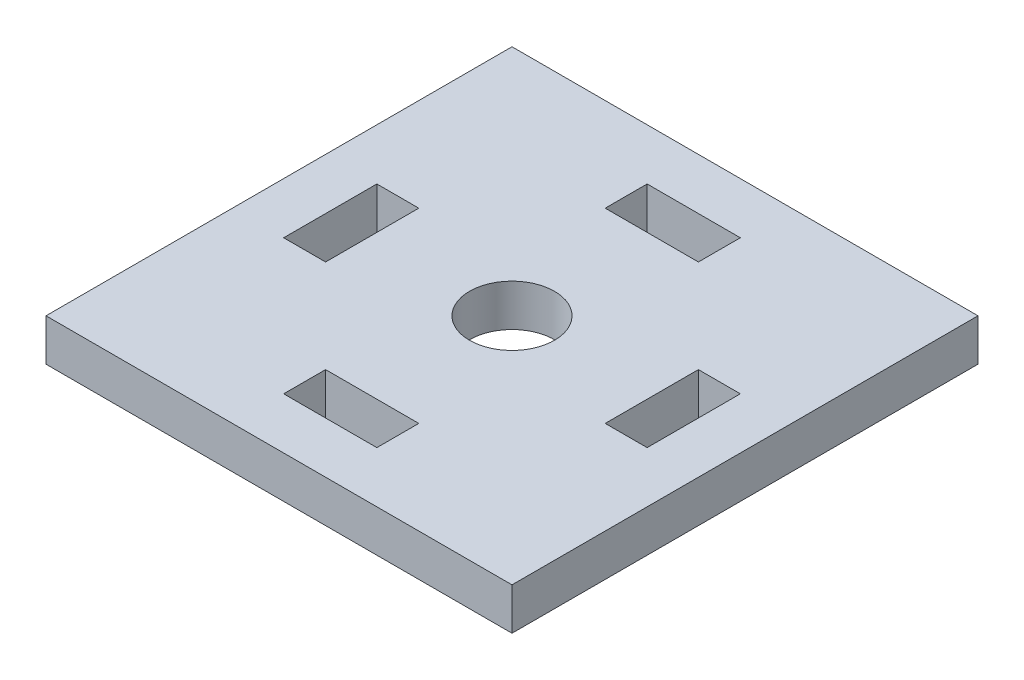
ISO-10303-21;
HEADER;
FILE_DESCRIPTION(('STEP AP214'),'2;1');
FILE_NAME('part.step','',(''),(''),'','','');
FILE_SCHEMA(('AUTOMOTIVE_DESIGN { 1 0 10303 214 1 1 1 1 }'));
ENDSEC;
DATA;
#1=APPLICATION_CONTEXT('core data for automotive mechanical design processes');
#2=APPLICATION_PROTOCOL_DEFINITION('international standard','automotive_design',2000,#1);
#3=PRODUCT_CONTEXT('',#1,'mechanical');
#4=PRODUCT('Part','Part','',(#3));
#5=PRODUCT_RELATED_PRODUCT_CATEGORY('part','',(#4));
#6=PRODUCT_DEFINITION_FORMATION('','',#4);
#7=PRODUCT_DEFINITION_CONTEXT('part definition',#1,'design');
#8=PRODUCT_DEFINITION('design','',#6,#7);
#9=PRODUCT_DEFINITION_SHAPE('','',#8);
#10=(LENGTH_UNIT() NAMED_UNIT(*) SI_UNIT(.MILLI.,.METRE.));
#11=(NAMED_UNIT(*) PLANE_ANGLE_UNIT() SI_UNIT($,.RADIAN.));
#12=(NAMED_UNIT(*) SI_UNIT($,.STERADIAN.) SOLID_ANGLE_UNIT());
#13=UNCERTAINTY_MEASURE_WITH_UNIT(LENGTH_MEASURE(1.E-05),#10,'distance_accuracy_value','');
#14=(GEOMETRIC_REPRESENTATION_CONTEXT(3) GLOBAL_UNCERTAINTY_ASSIGNED_CONTEXT((#13)) GLOBAL_UNIT_ASSIGNED_CONTEXT((#10,
#11,#12)) REPRESENTATION_CONTEXT('',''));
#15=CARTESIAN_POINT('',(0.,0.,0.));
#16=DIRECTION('',(0.,0.,1.));
#17=DIRECTION('',(1.,0.,0.));
#18=AXIS2_PLACEMENT_3D('',#15,#16,#17);
#19=CARTESIAN_POINT('',(0.,4.5,0.));
#20=DIRECTION('',(0.,1.,0.));
#21=DIRECTION('',(0.,0.,1.));
#22=AXIS2_PLACEMENT_3D('',#19,#20,#21);
#23=PLANE('',#22);
#24=DIRECTION('',(1.,0.,0.));
#25=VECTOR('',#24,1.);
#26=CARTESIAN_POINT('',(-42.3831540498993,4.5,29.5962526015653));
#27=LINE('',#26,#25);
#28=CARTESIAN_POINT('',(-42.3831540498993,4.5,29.5962526015653));
#29=VERTEX_POINT('',#28);
#30=CARTESIAN_POINT('',(-37.8831540498994,4.5,29.5962526015653));
#31=VERTEX_POINT('',#30);
#32=EDGE_CURVE('E278',#29,#31,#27,.T.);
#33=ORIENTED_EDGE('',*,*,#32,.F.);
#34=DIRECTION('',(0.,0.,1.));
#35=VECTOR('',#34,1.);
#36=CARTESIAN_POINT('',(-42.3831540498993,4.5,19.5962526015653));
#37=LINE('',#36,#35);
#38=CARTESIAN_POINT('',(-42.3831540498993,4.5,19.5962526015653));
#39=VERTEX_POINT('',#38);
#40=EDGE_CURVE('E276',#39,#29,#37,.T.);
#41=ORIENTED_EDGE('',*,*,#40,.F.);
#42=DIRECTION('',(-1.,0.,0.));
#43=VECTOR('',#42,1.);
#44=CARTESIAN_POINT('',(-42.3831540498993,4.5,19.5962526015653));
#45=LINE('',#44,#43);
#46=CARTESIAN_POINT('',(-37.8831540498994,4.5,19.5962526015653));
#47=VERTEX_POINT('',#46);
#48=EDGE_CURVE('E284',#47,#39,#45,.T.);
#49=ORIENTED_EDGE('',*,*,#48,.F.);
#50=DIRECTION('',(0.,0.,-1.));
#51=VECTOR('',#50,1.);
#52=CARTESIAN_POINT('',(-37.8831540498994,4.5,19.5962526015653));
#53=LINE('',#52,#51);
#54=EDGE_CURVE('E281',#31,#47,#53,.T.);
#55=ORIENTED_EDGE('',*,*,#54,.F.);
#56=EDGE_LOOP('',(#33,#41,#49,#55));
#57=FACE_BOUND('',#56,.T.);
#58=DIRECTION('',(0.,0.,-1.));
#59=VECTOR('',#58,1.);
#60=CARTESIAN_POINT('',(2.11684595010066,4.5,-0.403747398434721));
#61=LINE('',#60,#59);
#62=CARTESIAN_POINT('',(2.11684595010067,4.5,49.5962526015653));
#63=VERTEX_POINT('',#62);
#64=CARTESIAN_POINT('',(2.11684595010066,4.5,-0.403747398434721));
#65=VERTEX_POINT('',#64);
#66=EDGE_CURVE('E307',#63,#65,#61,.T.);
#67=ORIENTED_EDGE('',*,*,#66,.T.);
#68=DIRECTION('',(-1.,0.,0.));
#69=VECTOR('',#68,1.);
#70=CARTESIAN_POINT('',(-47.8831540498993,4.5,-0.403747398434712));
#71=LINE('',#70,#69);
#72=CARTESIAN_POINT('',(-47.8831540498993,4.5,-0.403747398434712));
#73=VERTEX_POINT('',#72);
#74=EDGE_CURVE('E310',#65,#73,#71,.T.);
#75=ORIENTED_EDGE('',*,*,#74,.T.);
#76=DIRECTION('',(0.,0.,1.));
#77=VECTOR('',#76,1.);
#78=CARTESIAN_POINT('',(-47.8831540498993,4.5,-0.403747398434712));
#79=LINE('',#78,#77);
#80=CARTESIAN_POINT('',(-47.8831540498993,4.5,49.5962526015653));
#81=VERTEX_POINT('',#80);
#82=EDGE_CURVE('E313',#73,#81,#79,.T.);
#83=ORIENTED_EDGE('',*,*,#82,.T.);
#84=DIRECTION('',(1.,0.,0.));
#85=VECTOR('',#84,1.);
#86=CARTESIAN_POINT('',(-47.8831540498993,4.5,49.5962526015653));
#87=LINE('',#86,#85);
#88=EDGE_CURVE('E315',#81,#63,#87,.T.);
#89=ORIENTED_EDGE('',*,*,#88,.T.);
#90=EDGE_LOOP('',(#67,#75,#83,#89));
#91=FACE_BOUND('',#90,.T.);
#92=CARTESIAN_POINT('',(-22.8831540498993,4.5,24.5962526015653));
#93=DIRECTION('',(0.,1.,0.));
#94=DIRECTION('',(0.,0.,1.));
#95=AXIS2_PLACEMENT_3D('',#92,#93,#94);
#96=CIRCLE('',#95,4.55772387769697);
#97=CARTESIAN_POINT('',(-22.8831540498993,4.5,29.1539764792623));
#98=VERTEX_POINT('',#97);
#99=EDGE_CURVE('E270',#98,#98,#96,.T.);
#100=ORIENTED_EDGE('',*,*,#99,.F.);
#101=EDGE_LOOP('',(#100));
#102=FACE_BOUND('',#101,.T.);
#103=DIRECTION('',(-1.,0.,0.));
#104=VECTOR('',#103,1.);
#105=CARTESIAN_POINT('',(-17.8831540498996,4.5,5.09625260156507));
#106=LINE('',#105,#104);
#107=CARTESIAN_POINT('',(-17.8831540498996,4.5,5.09625260156507));
#108=VERTEX_POINT('',#107);
#109=CARTESIAN_POINT('',(-27.8831540498996,4.5,5.09625260156507));
#110=VERTEX_POINT('',#109);
#111=EDGE_CURVE('E241',#108,#110,#106,.T.);
#112=ORIENTED_EDGE('',*,*,#111,.F.);
#113=DIRECTION('',(0.,0.,-1.));
#114=VECTOR('',#113,1.);
#115=CARTESIAN_POINT('',(-17.8831540498996,4.5,5.09625260156507));
#116=LINE('',#115,#114);
#117=CARTESIAN_POINT('',(-17.8831540498996,4.5,9.59625260156507));
#118=VERTEX_POINT('',#117);
#119=EDGE_CURVE('E239',#118,#108,#116,.T.);
#120=ORIENTED_EDGE('',*,*,#119,.F.);
#121=DIRECTION('',(1.,0.,0.));
#122=VECTOR('',#121,1.);
#123=CARTESIAN_POINT('',(-17.8831540498996,4.5,9.59625260156507));
#124=LINE('',#123,#122);
#125=CARTESIAN_POINT('',(-27.8831540498996,4.5,9.59625260156507));
#126=VERTEX_POINT('',#125);
#127=EDGE_CURVE('E247',#126,#118,#124,.T.);
#128=ORIENTED_EDGE('',*,*,#127,.F.);
#129=DIRECTION('',(0.,0.,1.));
#130=VECTOR('',#129,1.);
#131=CARTESIAN_POINT('',(-27.8831540498996,4.5,5.09625260156507));
#132=LINE('',#131,#130);
#133=EDGE_CURVE('E244',#110,#126,#132,.T.);
#134=ORIENTED_EDGE('',*,*,#133,.F.);
#135=EDGE_LOOP('',(#112,#120,#128,#134));
#136=FACE_BOUND('',#135,.T.);
#137=DIRECTION('',(0.,0.,-1.));
#138=VECTOR('',#137,1.);
#139=CARTESIAN_POINT('',(-3.38315404989933,4.5,29.5962526015649));
#140=LINE('',#139,#138);
#141=CARTESIAN_POINT('',(-3.38315404989933,4.5,29.5962526015649));
#142=VERTEX_POINT('',#141);
#143=CARTESIAN_POINT('',(-3.38315404989934,4.5,19.5962526015649));
#144=VERTEX_POINT('',#143);
#145=EDGE_CURVE('E210',#142,#144,#140,.T.);
#146=ORIENTED_EDGE('',*,*,#145,.F.);
#147=DIRECTION('',(1.,0.,0.));
#148=VECTOR('',#147,1.);
#149=CARTESIAN_POINT('',(-3.38315404989933,4.5,29.5962526015649));
#150=LINE('',#149,#148);
#151=CARTESIAN_POINT('',(-7.88315404989933,4.5,29.5962526015649));
#152=VERTEX_POINT('',#151);
#153=EDGE_CURVE('E208',#152,#142,#150,.T.);
#154=ORIENTED_EDGE('',*,*,#153,.F.);
#155=DIRECTION('',(0.,0.,1.));
#156=VECTOR('',#155,1.);
#157=CARTESIAN_POINT('',(-7.88315404989933,4.5,29.5962526015649));
#158=LINE('',#157,#156);
#159=CARTESIAN_POINT('',(-7.88315404989934,4.5,19.5962526015649));
#160=VERTEX_POINT('',#159);
#161=EDGE_CURVE('E216',#160,#152,#158,.T.);
#162=ORIENTED_EDGE('',*,*,#161,.F.);
#163=DIRECTION('',(-1.,0.,0.));
#164=VECTOR('',#163,1.);
#165=CARTESIAN_POINT('',(-3.38315404989934,4.5,19.5962526015649));
#166=LINE('',#165,#164);
#167=EDGE_CURVE('E213',#144,#160,#166,.T.);
#168=ORIENTED_EDGE('',*,*,#167,.F.);
#169=EDGE_LOOP('',(#146,#154,#162,#168));
#170=FACE_BOUND('',#169,.T.);
#171=DIRECTION('',(1.,0.,0.));
#172=VECTOR('',#171,1.);
#173=CARTESIAN_POINT('',(-27.8831540498991,4.5,44.0962526015651));
#174=LINE('',#173,#172);
#175=CARTESIAN_POINT('',(-27.8831540498991,4.5,44.0962526015651));
#176=VERTEX_POINT('',#175);
#177=CARTESIAN_POINT('',(-17.8831540498991,4.5,44.0962526015651));
#178=VERTEX_POINT('',#177);
#179=EDGE_CURVE('E180',#176,#178,#174,.T.);
#180=ORIENTED_EDGE('',*,*,#179,.F.);
#181=DIRECTION('',(0.,0.,1.));
#182=VECTOR('',#181,1.);
#183=CARTESIAN_POINT('',(-27.8831540498991,4.5,44.0962526015651));
#184=LINE('',#183,#182);
#185=CARTESIAN_POINT('',(-27.8831540498991,4.5,39.5962526015651));
#186=VERTEX_POINT('',#185);
#187=EDGE_CURVE('E172',#186,#176,#184,.T.);
#188=ORIENTED_EDGE('',*,*,#187,.F.);
#189=DIRECTION('',(-1.,0.,0.));
#190=VECTOR('',#189,1.);
#191=CARTESIAN_POINT('',(-27.8831540498991,4.5,39.5962526015651));
#192=LINE('',#191,#190);
#193=CARTESIAN_POINT('',(-17.8831540498991,4.5,39.5962526015651));
#194=VERTEX_POINT('',#193);
#195=EDGE_CURVE('E194',#194,#186,#192,.T.);
#196=ORIENTED_EDGE('',*,*,#195,.F.);
#197=DIRECTION('',(0.,0.,-1.));
#198=VECTOR('',#197,1.);
#199=CARTESIAN_POINT('',(-17.8831540498991,4.5,44.0962526015651));
#200=LINE('',#199,#198);
#201=EDGE_CURVE('E192',#178,#194,#200,.T.);
#202=ORIENTED_EDGE('',*,*,#201,.F.);
#203=EDGE_LOOP('',(#180,#188,#196,#202));
#204=FACE_BOUND('',#203,.T.);
#205=ADVANCED_FACE('F35',(#57,#91,#102,#136,#170,#204),#23,.T.);
#206=CARTESIAN_POINT('',(0.,0.,0.));
#207=DIRECTION('',(0.,1.,0.));
#208=DIRECTION('',(0.,0.,1.));
#209=AXIS2_PLACEMENT_3D('',#206,#207,#208);
#210=PLANE('',#209);
#211=DIRECTION('',(1.,0.,0.));
#212=VECTOR('',#211,1.);
#213=CARTESIAN_POINT('',(-3.38315404989933,0.,29.5962526015649));
#214=LINE('',#213,#212);
#215=CARTESIAN_POINT('',(-7.88315404989933,0.,29.5962526015649));
#216=VERTEX_POINT('',#215);
#217=CARTESIAN_POINT('',(-3.38315404989933,0.,29.5962526015649));
#218=VERTEX_POINT('',#217);
#219=EDGE_CURVE('E188',#216,#218,#214,.T.);
#220=ORIENTED_EDGE('',*,*,#219,.T.);
#221=DIRECTION('',(0.,0.,-1.));
#222=VECTOR('',#221,1.);
#223=CARTESIAN_POINT('',(-3.38315404989933,0.,29.5962526015649));
#224=LINE('',#223,#222);
#225=CARTESIAN_POINT('',(-3.38315404989934,0.,19.5962526015649));
#226=VERTEX_POINT('',#225);
#227=EDGE_CURVE('E221',#218,#226,#224,.T.);
#228=ORIENTED_EDGE('',*,*,#227,.T.);
#229=DIRECTION('',(-1.,0.,0.));
#230=VECTOR('',#229,1.);
#231=CARTESIAN_POINT('',(-3.38315404989934,0.,19.5962526015649));
#232=LINE('',#231,#230);
#233=CARTESIAN_POINT('',(-7.88315404989934,0.,19.5962526015649));
#234=VERTEX_POINT('',#233);
#235=EDGE_CURVE('E224',#226,#234,#232,.T.);
#236=ORIENTED_EDGE('',*,*,#235,.T.);
#237=DIRECTION('',(0.,0.,1.));
#238=VECTOR('',#237,1.);
#239=CARTESIAN_POINT('',(-7.88315404989933,0.,29.5962526015649));
#240=LINE('',#239,#238);
#241=EDGE_CURVE('E211',#234,#216,#240,.T.);
#242=ORIENTED_EDGE('',*,*,#241,.T.);
#243=EDGE_LOOP('',(#220,#228,#236,#242));
#244=FACE_BOUND('',#243,.T.);
#245=CARTESIAN_POINT('',(-22.8831540498993,0.,24.5962526015653));
#246=DIRECTION('',(0.,1.,0.));
#247=DIRECTION('',(0.,0.,1.));
#248=AXIS2_PLACEMENT_3D('',#245,#246,#247);
#249=CIRCLE('',#248,4.55772387769697);
#250=CARTESIAN_POINT('',(-22.8831540498993,0.,29.1539764792623));
#251=VERTEX_POINT('',#250);
#252=EDGE_CURVE('E269',#251,#251,#249,.T.);
#253=ORIENTED_EDGE('',*,*,#252,.T.);
#254=EDGE_LOOP('',(#253));
#255=FACE_BOUND('',#254,.T.);
#256=DIRECTION('',(0.,0.,1.));
#257=VECTOR('',#256,1.);
#258=CARTESIAN_POINT('',(-42.3831540498993,0.,19.5962526015653));
#259=LINE('',#258,#257);
#260=CARTESIAN_POINT('',(-42.3831540498993,0.,19.5962526015653));
#261=VERTEX_POINT('',#260);
#262=CARTESIAN_POINT('',(-42.3831540498993,0.,29.5962526015653));
#263=VERTEX_POINT('',#262);
#264=EDGE_CURVE('E273',#261,#263,#259,.T.);
#265=ORIENTED_EDGE('',*,*,#264,.T.);
#266=DIRECTION('',(1.,0.,0.));
#267=VECTOR('',#266,1.);
#268=CARTESIAN_POINT('',(-42.3831540498993,0.,29.5962526015653));
#269=LINE('',#268,#267);
#270=CARTESIAN_POINT('',(-37.8831540498994,0.,29.5962526015653));
#271=VERTEX_POINT('',#270);
#272=EDGE_CURVE('E289',#263,#271,#269,.T.);
#273=ORIENTED_EDGE('',*,*,#272,.T.);
#274=DIRECTION('',(0.,0.,-1.));
#275=VECTOR('',#274,1.);
#276=CARTESIAN_POINT('',(-37.8831540498994,0.,19.5962526015653));
#277=LINE('',#276,#275);
#278=CARTESIAN_POINT('',(-37.8831540498994,0.,19.5962526015653));
#279=VERTEX_POINT('',#278);
#280=EDGE_CURVE('E292',#271,#279,#277,.T.);
#281=ORIENTED_EDGE('',*,*,#280,.T.);
#282=DIRECTION('',(-1.,0.,0.));
#283=VECTOR('',#282,1.);
#284=CARTESIAN_POINT('',(-42.3831540498993,0.,19.5962526015653));
#285=LINE('',#284,#283);
#286=EDGE_CURVE('E279',#279,#261,#285,.T.);
#287=ORIENTED_EDGE('',*,*,#286,.T.);
#288=EDGE_LOOP('',(#265,#273,#281,#287));
#289=FACE_BOUND('',#288,.T.);
#290=DIRECTION('',(0.,0.,-1.));
#291=VECTOR('',#290,1.);
#292=CARTESIAN_POINT('',(2.11684595010066,0.,-0.403747398434721));
#293=LINE('',#292,#291);
#294=CARTESIAN_POINT('',(2.11684595010067,0.,49.5962526015653));
#295=VERTEX_POINT('',#294);
#296=CARTESIAN_POINT('',(2.11684595010066,0.,-0.403747398434721));
#297=VERTEX_POINT('',#296);
#298=EDGE_CURVE('E306',#295,#297,#293,.T.);
#299=ORIENTED_EDGE('',*,*,#298,.F.);
#300=DIRECTION('',(1.,0.,0.));
#301=VECTOR('',#300,1.);
#302=CARTESIAN_POINT('',(-47.8831540498993,0.,49.5962526015653));
#303=LINE('',#302,#301);
#304=CARTESIAN_POINT('',(-47.8831540498993,0.,49.5962526015653));
#305=VERTEX_POINT('',#304);
#306=EDGE_CURVE('E311',#305,#295,#303,.T.);
#307=ORIENTED_EDGE('',*,*,#306,.F.);
#308=DIRECTION('',(0.,0.,1.));
#309=VECTOR('',#308,1.);
#310=CARTESIAN_POINT('',(-47.8831540498993,0.,-0.403747398434712));
#311=LINE('',#310,#309);
#312=CARTESIAN_POINT('',(-47.8831540498993,0.,-0.403747398434712));
#313=VERTEX_POINT('',#312);
#314=EDGE_CURVE('E322',#313,#305,#311,.T.);
#315=ORIENTED_EDGE('',*,*,#314,.F.);
#316=DIRECTION('',(-1.,0.,0.));
#317=VECTOR('',#316,1.);
#318=CARTESIAN_POINT('',(-47.8831540498993,0.,-0.403747398434712));
#319=LINE('',#318,#317);
#320=EDGE_CURVE('E320',#297,#313,#319,.T.);
#321=ORIENTED_EDGE('',*,*,#320,.F.);
#322=EDGE_LOOP('',(#299,#307,#315,#321));
#323=FACE_BOUND('',#322,.T.);
#324=DIRECTION('',(0.,0.,-1.));
#325=VECTOR('',#324,1.);
#326=CARTESIAN_POINT('',(-17.8831540498996,0.,5.09625260156507));
#327=LINE('',#326,#325);
#328=CARTESIAN_POINT('',(-17.8831540498996,0.,9.59625260156507));
#329=VERTEX_POINT('',#328);
#330=CARTESIAN_POINT('',(-17.8831540498996,0.,5.09625260156507));
#331=VERTEX_POINT('',#330);
#332=EDGE_CURVE('E238',#329,#331,#327,.T.);
#333=ORIENTED_EDGE('',*,*,#332,.T.);
#334=DIRECTION('',(-1.,0.,0.));
#335=VECTOR('',#334,1.);
#336=CARTESIAN_POINT('',(-17.8831540498996,0.,5.09625260156507));
#337=LINE('',#336,#335);
#338=CARTESIAN_POINT('',(-27.8831540498996,0.,5.09625260156507));
#339=VERTEX_POINT('',#338);
#340=EDGE_CURVE('E252',#331,#339,#337,.T.);
#341=ORIENTED_EDGE('',*,*,#340,.T.);
#342=DIRECTION('',(0.,0.,1.));
#343=VECTOR('',#342,1.);
#344=CARTESIAN_POINT('',(-27.8831540498996,0.,5.09625260156507));
#345=LINE('',#344,#343);
#346=CARTESIAN_POINT('',(-27.8831540498996,0.,9.59625260156507));
#347=VERTEX_POINT('',#346);
#348=EDGE_CURVE('E255',#339,#347,#345,.T.);
#349=ORIENTED_EDGE('',*,*,#348,.T.);
#350=DIRECTION('',(1.,0.,0.));
#351=VECTOR('',#350,1.);
#352=CARTESIAN_POINT('',(-17.8831540498996,0.,9.59625260156507));
#353=LINE('',#352,#351);
#354=EDGE_CURVE('E242',#347,#329,#353,.T.);
#355=ORIENTED_EDGE('',*,*,#354,.T.);
#356=EDGE_LOOP('',(#333,#341,#349,#355));
#357=FACE_BOUND('',#356,.T.);
#358=DIRECTION('',(0.,0.,1.));
#359=VECTOR('',#358,1.);
#360=CARTESIAN_POINT('',(-27.8831540498991,0.,44.0962526015651));
#361=LINE('',#360,#359);
#362=CARTESIAN_POINT('',(-27.8831540498991,0.,39.5962526015651));
#363=VERTEX_POINT('',#362);
#364=CARTESIAN_POINT('',(-27.8831540498991,0.,44.0962526015651));
#365=VERTEX_POINT('',#364);
#366=EDGE_CURVE('E58',#363,#365,#361,.T.);
#367=ORIENTED_EDGE('',*,*,#366,.T.);
#368=DIRECTION('',(1.,0.,0.));
#369=VECTOR('',#368,1.);
#370=CARTESIAN_POINT('',(-27.8831540498991,0.,44.0962526015651));
#371=LINE('',#370,#369);
#372=CARTESIAN_POINT('',(-17.8831540498991,0.,44.0962526015651));
#373=VERTEX_POINT('',#372);
#374=EDGE_CURVE('E187',#365,#373,#371,.T.);
#375=ORIENTED_EDGE('',*,*,#374,.T.);
#376=DIRECTION('',(0.,0.,-1.));
#377=VECTOR('',#376,1.);
#378=CARTESIAN_POINT('',(-17.8831540498991,0.,44.0962526015651));
#379=LINE('',#378,#377);
#380=CARTESIAN_POINT('',(-17.8831540498991,0.,39.5962526015651));
#381=VERTEX_POINT('',#380);
#382=EDGE_CURVE('E200',#373,#381,#379,.T.);
#383=ORIENTED_EDGE('',*,*,#382,.T.);
#384=DIRECTION('',(-1.,0.,0.));
#385=VECTOR('',#384,1.);
#386=CARTESIAN_POINT('',(-27.8831540498991,0.,39.5962526015651));
#387=LINE('',#386,#385);
#388=EDGE_CURVE('E181',#381,#363,#387,.T.);
#389=ORIENTED_EDGE('',*,*,#388,.T.);
#390=EDGE_LOOP('',(#367,#375,#383,#389));
#391=FACE_BOUND('',#390,.T.);
#392=ADVANCED_FACE('F340',(#244,#255,#289,#323,#357,#391),#210,.F.);
#393=CARTESIAN_POINT('',(2.11684595010066,4.5,-0.403747398434721));
#394=DIRECTION('',(-1.,0.,0.));
#395=DIRECTION('',(0.,0.,1.));
#396=AXIS2_PLACEMENT_3D('',#393,#394,#395);
#397=PLANE('',#396);
#398=ORIENTED_EDGE('',*,*,#298,.T.);
#399=DIRECTION('',(0.,-1.,0.));
#400=VECTOR('',#399,1.);
#401=CARTESIAN_POINT('',(2.11684595010066,4.5,-0.403747398434721));
#402=LINE('',#401,#400);
#403=EDGE_CURVE('E11',#65,#297,#402,.T.);
#404=ORIENTED_EDGE('',*,*,#403,.F.);
#405=ORIENTED_EDGE('',*,*,#66,.F.);
#406=DIRECTION('',(0.,-1.,0.));
#407=VECTOR('',#406,1.);
#408=CARTESIAN_POINT('',(2.11684595010067,4.5,49.5962526015653));
#409=LINE('',#408,#407);
#410=EDGE_CURVE('E317',#63,#295,#409,.T.);
#411=ORIENTED_EDGE('',*,*,#410,.T.);
#412=EDGE_LOOP('',(#398,#404,#405,#411));
#413=FACE_BOUND('',#412,.T.);
#414=ADVANCED_FACE('F37',(#413),#397,.F.);
#415=CARTESIAN_POINT('',(-47.8831540498993,4.5,-0.403747398434712));
#416=DIRECTION('',(0.,0.,1.));
#417=DIRECTION('',(1.,0.,0.));
#418=AXIS2_PLACEMENT_3D('',#415,#416,#417);
#419=PLANE('',#418);
#420=ORIENTED_EDGE('',*,*,#320,.T.);
#421=DIRECTION('',(0.,-1.,0.));
#422=VECTOR('',#421,1.);
#423=CARTESIAN_POINT('',(-47.8831540498993,4.5,-0.403747398434712));
#424=LINE('',#423,#422);
#425=EDGE_CURVE('E43',#73,#313,#424,.T.);
#426=ORIENTED_EDGE('',*,*,#425,.F.);
#427=ORIENTED_EDGE('',*,*,#74,.F.);
#428=ORIENTED_EDGE('',*,*,#403,.T.);
#429=EDGE_LOOP('',(#420,#426,#427,#428));
#430=FACE_BOUND('',#429,.T.);
#431=ADVANCED_FACE('F351',(#430),#419,.F.);
#432=CARTESIAN_POINT('',(-47.8831540498993,4.5,-0.403747398434712));
#433=DIRECTION('',(1.,0.,0.));
#434=DIRECTION('',(0.,0.,-1.));
#435=AXIS2_PLACEMENT_3D('',#432,#433,#434);
#436=PLANE('',#435);
#437=ORIENTED_EDGE('',*,*,#314,.T.);
#438=DIRECTION('',(0.,-1.,0.));
#439=VECTOR('',#438,1.);
#440=CARTESIAN_POINT('',(-47.8831540498993,4.5,49.5962526015653));
#441=LINE('',#440,#439);
#442=EDGE_CURVE('E327',#81,#305,#441,.T.);
#443=ORIENTED_EDGE('',*,*,#442,.F.);
#444=ORIENTED_EDGE('',*,*,#82,.F.);
#445=ORIENTED_EDGE('',*,*,#425,.T.);
#446=EDGE_LOOP('',(#437,#443,#444,#445));
#447=FACE_BOUND('',#446,.T.);
#448=ADVANCED_FACE('F334',(#447),#436,.F.);
#449=CARTESIAN_POINT('',(-47.8831540498993,4.5,49.5962526015653));
#450=DIRECTION('',(0.,0.,-1.));
#451=DIRECTION('',(-1.,0.,0.));
#452=AXIS2_PLACEMENT_3D('',#449,#450,#451);
#453=PLANE('',#452);
#454=ORIENTED_EDGE('',*,*,#306,.T.);
#455=ORIENTED_EDGE('',*,*,#410,.F.);
#456=ORIENTED_EDGE('',*,*,#88,.F.);
#457=ORIENTED_EDGE('',*,*,#442,.T.);
#458=EDGE_LOOP('',(#454,#455,#456,#457));
#459=FACE_BOUND('',#458,.T.);
#460=ADVANCED_FACE('F344',(#459),#453,.F.);
#461=CARTESIAN_POINT('',(-42.3831540498993,4.5,19.5962526015653));
#462=DIRECTION('',(1.,0.,0.));
#463=DIRECTION('',(0.,0.,-1.));
#464=AXIS2_PLACEMENT_3D('',#461,#462,#463);
#465=PLANE('',#464);
#466=ORIENTED_EDGE('',*,*,#264,.F.);
#467=DIRECTION('',(0.,-1.,0.));
#468=VECTOR('',#467,1.);
#469=CARTESIAN_POINT('',(-42.3831540498993,4.5,19.5962526015653));
#470=LINE('',#469,#468);
#471=EDGE_CURVE('E286',#39,#261,#470,.T.);
#472=ORIENTED_EDGE('',*,*,#471,.F.);
#473=ORIENTED_EDGE('',*,*,#40,.T.);
#474=DIRECTION('',(0.,-1.,0.));
#475=VECTOR('',#474,1.);
#476=CARTESIAN_POINT('',(-42.3831540498993,4.5,29.5962526015653));
#477=LINE('',#476,#475);
#478=EDGE_CURVE('E303',#29,#263,#477,.T.);
#479=ORIENTED_EDGE('',*,*,#478,.T.);
#480=EDGE_LOOP('',(#466,#472,#473,#479));
#481=FACE_BOUND('',#480,.T.);
#482=ADVANCED_FACE('F368',(#481),#465,.T.);
#483=CARTESIAN_POINT('',(-42.3831540498993,4.5,29.5962526015653));
#484=DIRECTION('',(0.,0.,-1.));
#485=DIRECTION('',(-1.,0.,0.));
#486=AXIS2_PLACEMENT_3D('',#483,#484,#485);
#487=PLANE('',#486);
#488=ORIENTED_EDGE('',*,*,#272,.F.);
#489=ORIENTED_EDGE('',*,*,#478,.F.);
#490=ORIENTED_EDGE('',*,*,#32,.T.);
#491=DIRECTION('',(0.,-1.,0.));
#492=VECTOR('',#491,1.);
#493=CARTESIAN_POINT('',(-37.8831540498994,4.5,29.5962526015653));
#494=LINE('',#493,#492);
#495=EDGE_CURVE('E301',#31,#271,#494,.T.);
#496=ORIENTED_EDGE('',*,*,#495,.T.);
#497=EDGE_LOOP('',(#488,#489,#490,#496));
#498=FACE_BOUND('',#497,.T.);
#499=ADVANCED_FACE('F375',(#498),#487,.T.);
#500=CARTESIAN_POINT('',(-37.8831540498994,4.5,19.5962526015653));
#501=DIRECTION('',(-1.,0.,0.));
#502=DIRECTION('',(0.,0.,1.));
#503=AXIS2_PLACEMENT_3D('',#500,#501,#502);
#504=PLANE('',#503);
#505=ORIENTED_EDGE('',*,*,#280,.F.);
#506=ORIENTED_EDGE('',*,*,#495,.F.);
#507=ORIENTED_EDGE('',*,*,#54,.T.);
#508=DIRECTION('',(0.,-1.,0.));
#509=VECTOR('',#508,1.);
#510=CARTESIAN_POINT('',(-37.8831540498994,4.5,19.5962526015653));
#511=LINE('',#510,#509);
#512=EDGE_CURVE('E299',#47,#279,#511,.T.);
#513=ORIENTED_EDGE('',*,*,#512,.T.);
#514=EDGE_LOOP('',(#505,#506,#507,#513));
#515=FACE_BOUND('',#514,.T.);
#516=ADVANCED_FACE('F380',(#515),#504,.T.);
#517=CARTESIAN_POINT('',(-42.3831540498993,4.5,19.5962526015653));
#518=DIRECTION('',(0.,0.,1.));
#519=DIRECTION('',(1.,0.,0.));
#520=AXIS2_PLACEMENT_3D('',#517,#518,#519);
#521=PLANE('',#520);
#522=ORIENTED_EDGE('',*,*,#286,.F.);
#523=ORIENTED_EDGE('',*,*,#512,.F.);
#524=ORIENTED_EDGE('',*,*,#48,.T.);
#525=ORIENTED_EDGE('',*,*,#471,.T.);
#526=EDGE_LOOP('',(#522,#523,#524,#525));
#527=FACE_BOUND('',#526,.T.);
#528=ADVANCED_FACE('F388',(#527),#521,.T.);
#529=CARTESIAN_POINT('',(-22.8831540498993,4.5,24.5962526015653));
#530=DIRECTION('',(0.,-1.,0.));
#531=DIRECTION('',(0.,0.,-1.));
#532=AXIS2_PLACEMENT_3D('',#529,#530,#531);
#533=CYLINDRICAL_SURFACE('',#532,4.55772387769697);
#534=ORIENTED_EDGE('',*,*,#99,.T.);
#535=EDGE_LOOP('',(#534));
#536=FACE_BOUND('',#535,.T.);
#537=ORIENTED_EDGE('',*,*,#252,.F.);
#538=EDGE_LOOP('',(#537));
#539=FACE_BOUND('',#538,.T.);
#540=ADVANCED_FACE('F399',(#536,#539),#533,.F.);
#541=CARTESIAN_POINT('',(-17.8831540498996,4.5,5.09625260156507));
#542=DIRECTION('',(-1.,0.,0.));
#543=DIRECTION('',(0.,0.,1.));
#544=AXIS2_PLACEMENT_3D('',#541,#542,#543);
#545=PLANE('',#544);
#546=ORIENTED_EDGE('',*,*,#332,.F.);
#547=DIRECTION('',(0.,-1.,0.));
#548=VECTOR('',#547,1.);
#549=CARTESIAN_POINT('',(-17.8831540498996,4.5,9.59625260156507));
#550=LINE('',#549,#548);
#551=EDGE_CURVE('E249',#118,#329,#550,.T.);
#552=ORIENTED_EDGE('',*,*,#551,.F.);
#553=ORIENTED_EDGE('',*,*,#119,.T.);
#554=DIRECTION('',(0.,-1.,0.));
#555=VECTOR('',#554,1.);
#556=CARTESIAN_POINT('',(-17.8831540498996,4.5,5.09625260156507));
#557=LINE('',#556,#555);
#558=EDGE_CURVE('E266',#108,#331,#557,.T.);
#559=ORIENTED_EDGE('',*,*,#558,.T.);
#560=EDGE_LOOP('',(#546,#552,#553,#559));
#561=FACE_BOUND('',#560,.T.);
#562=ADVANCED_FACE('F404',(#561),#545,.T.);
#563=CARTESIAN_POINT('',(-17.8831540498996,4.5,5.09625260156507));
#564=DIRECTION('',(0.,0.,1.));
#565=DIRECTION('',(1.,0.,0.));
#566=AXIS2_PLACEMENT_3D('',#563,#564,#565);
#567=PLANE('',#566);
#568=ORIENTED_EDGE('',*,*,#340,.F.);
#569=ORIENTED_EDGE('',*,*,#558,.F.);
#570=ORIENTED_EDGE('',*,*,#111,.T.);
#571=DIRECTION('',(0.,-1.,0.));
#572=VECTOR('',#571,1.);
#573=CARTESIAN_POINT('',(-27.8831540498996,4.5,5.09625260156507));
#574=LINE('',#573,#572);
#575=EDGE_CURVE('E264',#110,#339,#574,.T.);
#576=ORIENTED_EDGE('',*,*,#575,.T.);
#577=EDGE_LOOP('',(#568,#569,#570,#576));
#578=FACE_BOUND('',#577,.T.);
#579=ADVANCED_FACE('F408',(#578),#567,.T.);
#580=CARTESIAN_POINT('',(-27.8831540498996,4.5,5.09625260156507));
#581=DIRECTION('',(1.,0.,0.));
#582=DIRECTION('',(0.,0.,-1.));
#583=AXIS2_PLACEMENT_3D('',#580,#581,#582);
#584=PLANE('',#583);
#585=ORIENTED_EDGE('',*,*,#348,.F.);
#586=ORIENTED_EDGE('',*,*,#575,.F.);
#587=ORIENTED_EDGE('',*,*,#133,.T.);
#588=DIRECTION('',(0.,-1.,0.));
#589=VECTOR('',#588,1.);
#590=CARTESIAN_POINT('',(-27.8831540498996,4.5,9.59625260156507));
#591=LINE('',#590,#589);
#592=EDGE_CURVE('E262',#126,#347,#591,.T.);
#593=ORIENTED_EDGE('',*,*,#592,.T.);
#594=EDGE_LOOP('',(#585,#586,#587,#593));
#595=FACE_BOUND('',#594,.T.);
#596=ADVANCED_FACE('F412',(#595),#584,.T.);
#597=CARTESIAN_POINT('',(-17.8831540498996,4.5,9.59625260156507));
#598=DIRECTION('',(0.,0.,-1.));
#599=DIRECTION('',(-1.,0.,0.));
#600=AXIS2_PLACEMENT_3D('',#597,#598,#599);
#601=PLANE('',#600);
#602=ORIENTED_EDGE('',*,*,#354,.F.);
#603=ORIENTED_EDGE('',*,*,#592,.F.);
#604=ORIENTED_EDGE('',*,*,#127,.T.);
#605=ORIENTED_EDGE('',*,*,#551,.T.);
#606=EDGE_LOOP('',(#602,#603,#604,#605));
#607=FACE_BOUND('',#606,.T.);
#608=ADVANCED_FACE('F416',(#607),#601,.T.);
#609=CARTESIAN_POINT('',(-3.38315404989933,4.5,29.5962526015649));
#610=DIRECTION('',(0.,0.,-1.));
#611=DIRECTION('',(-1.,0.,0.));
#612=AXIS2_PLACEMENT_3D('',#609,#610,#611);
#613=PLANE('',#612);
#614=ORIENTED_EDGE('',*,*,#219,.F.);
#615=DIRECTION('',(0.,-1.,0.));
#616=VECTOR('',#615,1.);
#617=CARTESIAN_POINT('',(-7.88315404989933,4.5,29.5962526015649));
#618=LINE('',#617,#616);
#619=EDGE_CURVE('E218',#152,#216,#618,.T.);
#620=ORIENTED_EDGE('',*,*,#619,.F.);
#621=ORIENTED_EDGE('',*,*,#153,.T.);
#622=DIRECTION('',(0.,-1.,0.));
#623=VECTOR('',#622,1.);
#624=CARTESIAN_POINT('',(-3.38315404989933,4.5,29.5962526015649));
#625=LINE('',#624,#623);
#626=EDGE_CURVE('E235',#142,#218,#625,.T.);
#627=ORIENTED_EDGE('',*,*,#626,.T.);
#628=EDGE_LOOP('',(#614,#620,#621,#627));
#629=FACE_BOUND('',#628,.T.);
#630=ADVANCED_FACE('F420',(#629),#613,.T.);
#631=CARTESIAN_POINT('',(-3.38315404989933,4.5,29.5962526015649));
#632=DIRECTION('',(-1.,0.,0.));
#633=DIRECTION('',(0.,0.,1.));
#634=AXIS2_PLACEMENT_3D('',#631,#632,#633);
#635=PLANE('',#634);
#636=ORIENTED_EDGE('',*,*,#227,.F.);
#637=ORIENTED_EDGE('',*,*,#626,.F.);
#638=ORIENTED_EDGE('',*,*,#145,.T.);
#639=DIRECTION('',(0.,-1.,0.));
#640=VECTOR('',#639,1.);
#641=CARTESIAN_POINT('',(-3.38315404989934,4.5,19.5962526015649));
#642=LINE('',#641,#640);
#643=EDGE_CURVE('E233',#144,#226,#642,.T.);
#644=ORIENTED_EDGE('',*,*,#643,.T.);
#645=EDGE_LOOP('',(#636,#637,#638,#644));
#646=FACE_BOUND('',#645,.T.);
#647=ADVANCED_FACE('F424',(#646),#635,.T.);
#648=CARTESIAN_POINT('',(-3.38315404989934,4.5,19.5962526015649));
#649=DIRECTION('',(0.,0.,1.));
#650=DIRECTION('',(1.,0.,0.));
#651=AXIS2_PLACEMENT_3D('',#648,#649,#650);
#652=PLANE('',#651);
#653=ORIENTED_EDGE('',*,*,#235,.F.);
#654=ORIENTED_EDGE('',*,*,#643,.F.);
#655=ORIENTED_EDGE('',*,*,#167,.T.);
#656=DIRECTION('',(0.,-1.,0.));
#657=VECTOR('',#656,1.);
#658=CARTESIAN_POINT('',(-7.88315404989934,4.5,19.5962526015649));
#659=LINE('',#658,#657);
#660=EDGE_CURVE('E231',#160,#234,#659,.T.);
#661=ORIENTED_EDGE('',*,*,#660,.T.);
#662=EDGE_LOOP('',(#653,#654,#655,#661));
#663=FACE_BOUND('',#662,.T.);
#664=ADVANCED_FACE('F428',(#663),#652,.T.);
#665=CARTESIAN_POINT('',(-7.88315404989933,4.5,29.5962526015649));
#666=DIRECTION('',(1.,0.,0.));
#667=DIRECTION('',(0.,0.,-1.));
#668=AXIS2_PLACEMENT_3D('',#665,#666,#667);
#669=PLANE('',#668);
#670=ORIENTED_EDGE('',*,*,#241,.F.);
#671=ORIENTED_EDGE('',*,*,#660,.F.);
#672=ORIENTED_EDGE('',*,*,#161,.T.);
#673=ORIENTED_EDGE('',*,*,#619,.T.);
#674=EDGE_LOOP('',(#670,#671,#672,#673));
#675=FACE_BOUND('',#674,.T.);
#676=ADVANCED_FACE('F432',(#675),#669,.T.);
#677=CARTESIAN_POINT('',(-27.8831540498991,4.5,44.0962526015651));
#678=DIRECTION('',(1.,0.,0.));
#679=DIRECTION('',(0.,0.,-1.));
#680=AXIS2_PLACEMENT_3D('',#677,#678,#679);
#681=PLANE('',#680);
#682=ORIENTED_EDGE('',*,*,#366,.F.);
#683=DIRECTION('',(0.,-1.,0.));
#684=VECTOR('',#683,1.);
#685=CARTESIAN_POINT('',(-27.8831540498991,4.5,39.5962526015651));
#686=LINE('',#685,#684);
#687=EDGE_CURVE('E176',#186,#363,#686,.T.);
#688=ORIENTED_EDGE('',*,*,#687,.F.);
#689=ORIENTED_EDGE('',*,*,#187,.T.);
#690=DIRECTION('',(0.,-1.,0.));
#691=VECTOR('',#690,1.);
#692=CARTESIAN_POINT('',(-27.8831540498991,4.5,44.0962526015651));
#693=LINE('',#692,#691);
#694=EDGE_CURVE('E175',#176,#365,#693,.T.);
#695=ORIENTED_EDGE('',*,*,#694,.T.);
#696=EDGE_LOOP('',(#682,#688,#689,#695));
#697=FACE_BOUND('',#696,.T.);
#698=ADVANCED_FACE('F174',(#697),#681,.T.);
#699=CARTESIAN_POINT('',(-27.8831540498991,4.5,44.0962526015651));
#700=DIRECTION('',(0.,0.,-1.));
#701=DIRECTION('',(-1.,0.,0.));
#702=AXIS2_PLACEMENT_3D('',#699,#700,#701);
#703=PLANE('',#702);
#704=ORIENTED_EDGE('',*,*,#374,.F.);
#705=ORIENTED_EDGE('',*,*,#694,.F.);
#706=ORIENTED_EDGE('',*,*,#179,.T.);
#707=DIRECTION('',(0.,-1.,0.));
#708=VECTOR('',#707,1.);
#709=CARTESIAN_POINT('',(-17.8831540498991,4.5,44.0962526015651));
#710=LINE('',#709,#708);
#711=EDGE_CURVE('E189',#178,#373,#710,.T.);
#712=ORIENTED_EDGE('',*,*,#711,.T.);
#713=EDGE_LOOP('',(#704,#705,#706,#712));
#714=FACE_BOUND('',#713,.T.);
#715=ADVANCED_FACE('F184',(#714),#703,.T.);
#716=CARTESIAN_POINT('',(-17.8831540498991,4.5,44.0962526015651));
#717=DIRECTION('',(-1.,0.,0.));
#718=DIRECTION('',(0.,0.,1.));
#719=AXIS2_PLACEMENT_3D('',#716,#717,#718);
#720=PLANE('',#719);
#721=ORIENTED_EDGE('',*,*,#382,.F.);
#722=ORIENTED_EDGE('',*,*,#711,.F.);
#723=ORIENTED_EDGE('',*,*,#201,.T.);
#724=DIRECTION('',(0.,-1.,0.));
#725=VECTOR('',#724,1.);
#726=CARTESIAN_POINT('',(-17.8831540498991,4.5,39.5962526015651));
#727=LINE('',#726,#725);
#728=EDGE_CURVE('E50',#194,#381,#727,.T.);
#729=ORIENTED_EDGE('',*,*,#728,.T.);
#730=EDGE_LOOP('',(#721,#722,#723,#729));
#731=FACE_BOUND('',#730,.T.);
#732=ADVANCED_FACE('F441',(#731),#720,.T.);
#733=CARTESIAN_POINT('',(-27.8831540498991,4.5,39.5962526015651));
#734=DIRECTION('',(0.,0.,1.));
#735=DIRECTION('',(1.,0.,0.));
#736=AXIS2_PLACEMENT_3D('',#733,#734,#735);
#737=PLANE('',#736);
#738=ORIENTED_EDGE('',*,*,#388,.F.);
#739=ORIENTED_EDGE('',*,*,#728,.F.);
#740=ORIENTED_EDGE('',*,*,#195,.T.);
#741=ORIENTED_EDGE('',*,*,#687,.T.);
#742=EDGE_LOOP('',(#738,#739,#740,#741));
#743=FACE_BOUND('',#742,.T.);
#744=ADVANCED_FACE('F444',(#743),#737,.T.);
#745=CLOSED_SHELL('',(#205,#392,#414,#431,#448,#460,#482,#499,#516,#528,#540,#562,#579,#596,
#608,#630,#647,#664,#676,#698,#715,#732,#744));
#746=MANIFOLD_SOLID_BREP('B2',#745);
#747=ADVANCED_BREP_SHAPE_REPRESENTATION('',(#18,#746),#14);
#748=SHAPE_DEFINITION_REPRESENTATION(#9,#747);
ENDSEC;
END-ISO-10303-21;
